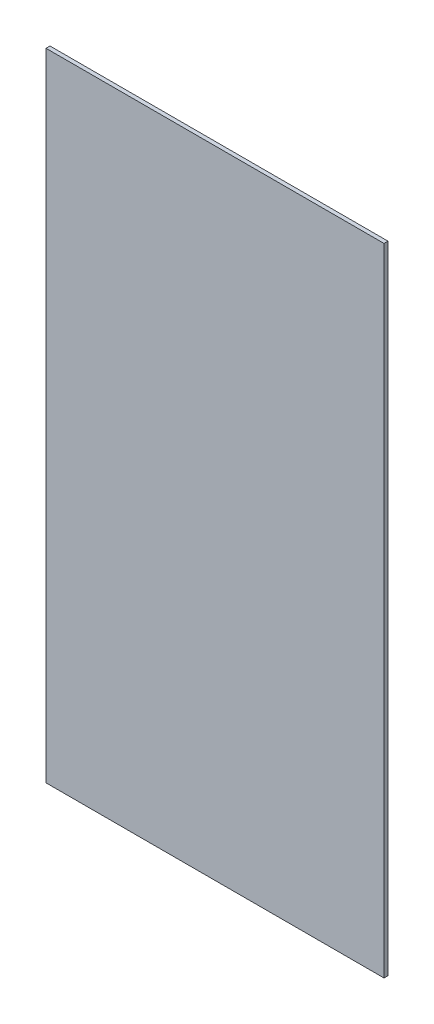
ISO-10303-21;
HEADER;
FILE_DESCRIPTION(('STEP AP214'),'2;1');
FILE_NAME('part.step','',(''),(''),'','','');
FILE_SCHEMA(('AUTOMOTIVE_DESIGN { 1 0 10303 214 1 1 1 1 }'));
ENDSEC;
DATA;
#1=APPLICATION_CONTEXT('core data for automotive mechanical design processes');
#2=APPLICATION_PROTOCOL_DEFINITION('international standard','automotive_design',2000,#1);
#3=PRODUCT_CONTEXT('',#1,'mechanical');
#4=PRODUCT('Part','Part','',(#3));
#5=PRODUCT_RELATED_PRODUCT_CATEGORY('part','',(#4));
#6=PRODUCT_DEFINITION_FORMATION('','',#4);
#7=PRODUCT_DEFINITION_CONTEXT('part definition',#1,'design');
#8=PRODUCT_DEFINITION('design','',#6,#7);
#9=PRODUCT_DEFINITION_SHAPE('','',#8);
#10=(LENGTH_UNIT() NAMED_UNIT(*) SI_UNIT(.MILLI.,.METRE.));
#11=(NAMED_UNIT(*) PLANE_ANGLE_UNIT() SI_UNIT($,.RADIAN.));
#12=(NAMED_UNIT(*) SI_UNIT($,.STERADIAN.) SOLID_ANGLE_UNIT());
#13=UNCERTAINTY_MEASURE_WITH_UNIT(LENGTH_MEASURE(1.E-05),#10,'distance_accuracy_value','');
#14=(GEOMETRIC_REPRESENTATION_CONTEXT(3) GLOBAL_UNCERTAINTY_ASSIGNED_CONTEXT((#13)) GLOBAL_UNIT_ASSIGNED_CONTEXT((#10,
#11,#12)) REPRESENTATION_CONTEXT('',''));
#15=CARTESIAN_POINT('',(0.,0.,0.));
#16=DIRECTION('',(0.,0.,1.));
#17=DIRECTION('',(1.,0.,0.));
#18=AXIS2_PLACEMENT_3D('',#15,#16,#17);
#19=CARTESIAN_POINT('',(85.,-160.,2.));
#20=DIRECTION('',(-1.,0.,0.));
#21=DIRECTION('',(0.,0.,1.));
#22=AXIS2_PLACEMENT_3D('',#19,#20,#21);
#23=PLANE('',#22);
#24=DIRECTION('',(0.,1.,0.));
#25=VECTOR('',#24,1.);
#26=CARTESIAN_POINT('',(85.,-160.,0.));
#27=LINE('',#26,#25);
#28=CARTESIAN_POINT('',(85.,-160.,0.));
#29=VERTEX_POINT('',#28);
#30=CARTESIAN_POINT('',(85.,160.,0.));
#31=VERTEX_POINT('',#30);
#32=EDGE_CURVE('E97',#29,#31,#27,.T.);
#33=ORIENTED_EDGE('',*,*,#32,.T.);
#34=DIRECTION('',(0.,0.,-1.));
#35=VECTOR('',#34,1.);
#36=CARTESIAN_POINT('',(85.,160.,2.));
#37=LINE('',#36,#35);
#38=CARTESIAN_POINT('',(85.,160.,2.));
#39=VERTEX_POINT('',#38);
#40=EDGE_CURVE('E11',#39,#31,#37,.T.);
#41=ORIENTED_EDGE('',*,*,#40,.F.);
#42=DIRECTION('',(0.,1.,0.));
#43=VECTOR('',#42,1.);
#44=CARTESIAN_POINT('',(85.,-160.,2.));
#45=LINE('',#44,#43);
#46=CARTESIAN_POINT('',(85.,-160.,2.));
#47=VERTEX_POINT('',#46);
#48=EDGE_CURVE('E85',#47,#39,#45,.T.);
#49=ORIENTED_EDGE('',*,*,#48,.F.);
#50=DIRECTION('',(0.,0.,-1.));
#51=VECTOR('',#50,1.);
#52=CARTESIAN_POINT('',(85.,-160.,2.));
#53=LINE('',#52,#51);
#54=EDGE_CURVE('E93',#47,#29,#53,.T.);
#55=ORIENTED_EDGE('',*,*,#54,.T.);
#56=EDGE_LOOP('',(#33,#41,#49,#55));
#57=FACE_BOUND('',#56,.T.);
#58=ADVANCED_FACE('F34',(#57),#23,.F.);
#59=CARTESIAN_POINT('',(-85.,160.,2.));
#60=DIRECTION('',(0.,-1.,0.));
#61=DIRECTION('',(0.,0.,-1.));
#62=AXIS2_PLACEMENT_3D('',#59,#60,#61);
#63=PLANE('',#62);
#64=DIRECTION('',(-1.,0.,0.));
#65=VECTOR('',#64,1.);
#66=CARTESIAN_POINT('',(-85.,160.,0.));
#67=LINE('',#66,#65);
#68=CARTESIAN_POINT('',(-85.,160.,0.));
#69=VERTEX_POINT('',#68);
#70=EDGE_CURVE('E89',#31,#69,#67,.T.);
#71=ORIENTED_EDGE('',*,*,#70,.T.);
#72=DIRECTION('',(0.,0.,-1.));
#73=VECTOR('',#72,1.);
#74=CARTESIAN_POINT('',(-85.,160.,2.));
#75=LINE('',#74,#73);
#76=CARTESIAN_POINT('',(-85.,160.,2.));
#77=VERTEX_POINT('',#76);
#78=EDGE_CURVE('E42',#77,#69,#75,.T.);
#79=ORIENTED_EDGE('',*,*,#78,.F.);
#80=DIRECTION('',(-1.,0.,0.));
#81=VECTOR('',#80,1.);
#82=CARTESIAN_POINT('',(-85.,160.,2.));
#83=LINE('',#82,#81);
#84=EDGE_CURVE('E80',#39,#77,#83,.T.);
#85=ORIENTED_EDGE('',*,*,#84,.F.);
#86=ORIENTED_EDGE('',*,*,#40,.T.);
#87=EDGE_LOOP('',(#71,#79,#85,#86));
#88=FACE_BOUND('',#87,.T.);
#89=ADVANCED_FACE('F88',(#88),#63,.F.);
#90=CARTESIAN_POINT('',(-85.,-160.,2.));
#91=DIRECTION('',(1.,0.,0.));
#92=DIRECTION('',(0.,0.,-1.));
#93=AXIS2_PLACEMENT_3D('',#90,#91,#92);
#94=PLANE('',#93);
#95=DIRECTION('',(0.,-1.,0.));
#96=VECTOR('',#95,1.);
#97=CARTESIAN_POINT('',(-85.,-160.,0.));
#98=LINE('',#97,#96);
#99=CARTESIAN_POINT('',(-85.,-160.,0.));
#100=VERTEX_POINT('',#99);
#101=EDGE_CURVE('E67',#69,#100,#98,.T.);
#102=ORIENTED_EDGE('',*,*,#101,.T.);
#103=DIRECTION('',(0.,0.,-1.));
#104=VECTOR('',#103,1.);
#105=CARTESIAN_POINT('',(-85.,-160.,2.));
#106=LINE('',#105,#104);
#107=CARTESIAN_POINT('',(-85.,-160.,2.));
#108=VERTEX_POINT('',#107);
#109=EDGE_CURVE('E90',#108,#100,#106,.T.);
#110=ORIENTED_EDGE('',*,*,#109,.F.);
#111=DIRECTION('',(0.,-1.,0.));
#112=VECTOR('',#111,1.);
#113=CARTESIAN_POINT('',(-85.,-160.,2.));
#114=LINE('',#113,#112);
#115=EDGE_CURVE('E83',#77,#108,#114,.T.);
#116=ORIENTED_EDGE('',*,*,#115,.F.);
#117=ORIENTED_EDGE('',*,*,#78,.T.);
#118=EDGE_LOOP('',(#102,#110,#116,#117));
#119=FACE_BOUND('',#118,.T.);
#120=ADVANCED_FACE('F91',(#119),#94,.F.);
#121=CARTESIAN_POINT('',(-85.,-160.,2.));
#122=DIRECTION('',(0.,1.,0.));
#123=DIRECTION('',(0.,0.,1.));
#124=AXIS2_PLACEMENT_3D('',#121,#122,#123);
#125=PLANE('',#124);
#126=DIRECTION('',(1.,0.,0.));
#127=VECTOR('',#126,1.);
#128=CARTESIAN_POINT('',(-85.,-160.,0.));
#129=LINE('',#128,#127);
#130=EDGE_CURVE('E73',#100,#29,#129,.T.);
#131=ORIENTED_EDGE('',*,*,#130,.T.);
#132=ORIENTED_EDGE('',*,*,#54,.F.);
#133=DIRECTION('',(1.,0.,0.));
#134=VECTOR('',#133,1.);
#135=CARTESIAN_POINT('',(-85.,-160.,2.));
#136=LINE('',#135,#134);
#137=EDGE_CURVE('E50',#108,#47,#136,.T.);
#138=ORIENTED_EDGE('',*,*,#137,.F.);
#139=ORIENTED_EDGE('',*,*,#109,.T.);
#140=EDGE_LOOP('',(#131,#132,#138,#139));
#141=FACE_BOUND('',#140,.T.);
#142=ADVANCED_FACE('F104',(#141),#125,.F.);
#143=CARTESIAN_POINT('',(0.,0.,2.));
#144=DIRECTION('',(0.,0.,-1.));
#145=DIRECTION('',(-1.,0.,0.));
#146=AXIS2_PLACEMENT_3D('',#143,#144,#145);
#147=PLANE('',#146);
#148=ORIENTED_EDGE('',*,*,#48,.T.);
#149=ORIENTED_EDGE('',*,*,#84,.T.);
#150=ORIENTED_EDGE('',*,*,#115,.T.);
#151=ORIENTED_EDGE('',*,*,#137,.T.);
#152=EDGE_LOOP('',(#148,#149,#150,#151));
#153=FACE_BOUND('',#152,.T.);
#154=ADVANCED_FACE('F81',(#153),#147,.F.);
#155=CARTESIAN_POINT('',(0.,0.,0.));
#156=DIRECTION('',(0.,0.,-1.));
#157=DIRECTION('',(-1.,0.,0.));
#158=AXIS2_PLACEMENT_3D('',#155,#156,#157);
#159=PLANE('',#158);
#160=ORIENTED_EDGE('',*,*,#32,.F.);
#161=ORIENTED_EDGE('',*,*,#130,.F.);
#162=ORIENTED_EDGE('',*,*,#101,.F.);
#163=ORIENTED_EDGE('',*,*,#70,.F.);
#164=EDGE_LOOP('',(#160,#161,#162,#163));
#165=FACE_BOUND('',#164,.T.);
#166=ADVANCED_FACE('F107',(#165),#159,.T.);
#167=CLOSED_SHELL('',(#58,#89,#120,#142,#154,#166));
#168=MANIFOLD_SOLID_BREP('B2',#167);
#169=ADVANCED_BREP_SHAPE_REPRESENTATION('',(#18,#168),#14);
#170=SHAPE_DEFINITION_REPRESENTATION(#9,#169);
ENDSEC;
END-ISO-10303-21;
